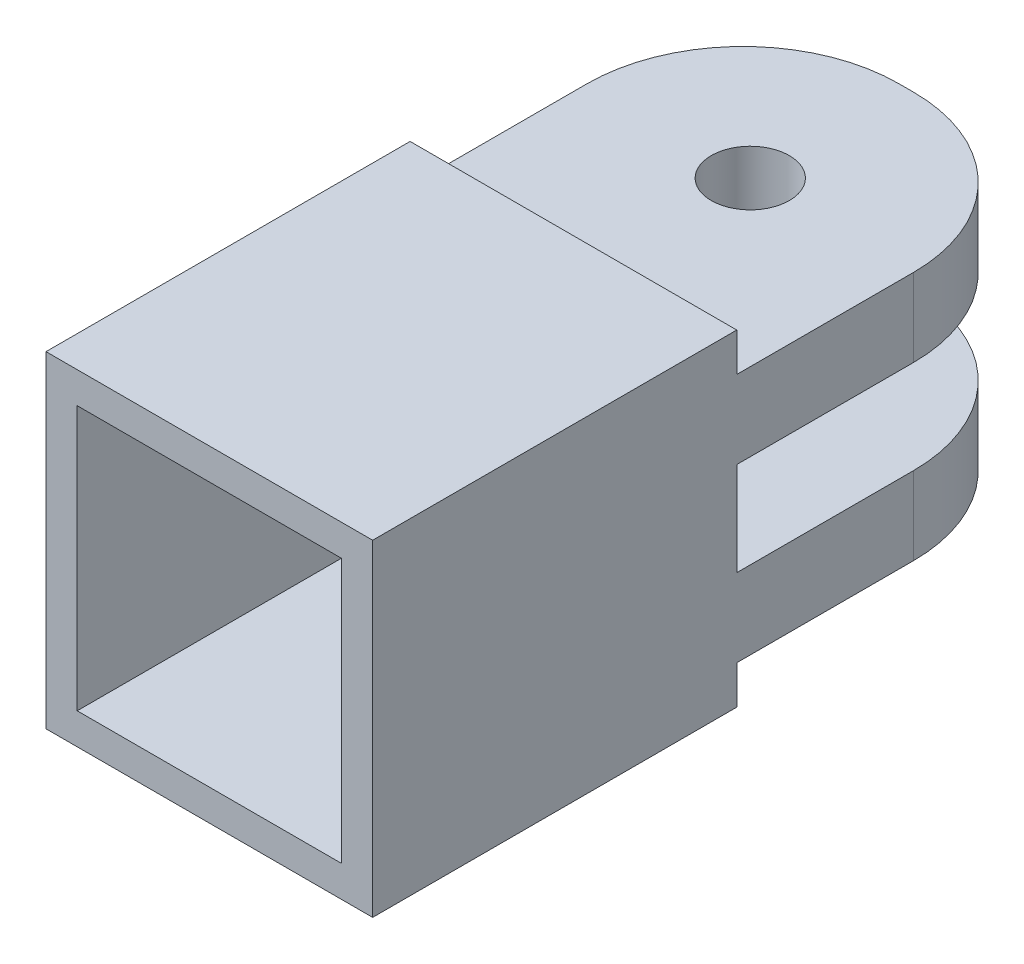
ISO-10303-21;
HEADER;
FILE_DESCRIPTION(('STEP AP214'),'2;1');
FILE_NAME('part.step','',(''),(''),'','','');
FILE_SCHEMA(('AUTOMOTIVE_DESIGN { 1 0 10303 214 1 1 1 1 }'));
ENDSEC;
DATA;
#1=APPLICATION_CONTEXT('core data for automotive mechanical design processes');
#2=APPLICATION_PROTOCOL_DEFINITION('international standard','automotive_design',2000,#1);
#3=PRODUCT_CONTEXT('',#1,'mechanical');
#4=PRODUCT('Part','Part','',(#3));
#5=PRODUCT_RELATED_PRODUCT_CATEGORY('part','',(#4));
#6=PRODUCT_DEFINITION_FORMATION('','',#4);
#7=PRODUCT_DEFINITION_CONTEXT('part definition',#1,'design');
#8=PRODUCT_DEFINITION('design','',#6,#7);
#9=PRODUCT_DEFINITION_SHAPE('','',#8);
#10=(LENGTH_UNIT() NAMED_UNIT(*) SI_UNIT(.MILLI.,.METRE.));
#11=(NAMED_UNIT(*) PLANE_ANGLE_UNIT() SI_UNIT($,.RADIAN.));
#12=(NAMED_UNIT(*) SI_UNIT($,.STERADIAN.) SOLID_ANGLE_UNIT());
#13=UNCERTAINTY_MEASURE_WITH_UNIT(LENGTH_MEASURE(1.E-05),#10,'distance_accuracy_value','');
#14=(GEOMETRIC_REPRESENTATION_CONTEXT(3) GLOBAL_UNCERTAINTY_ASSIGNED_CONTEXT((#13)) GLOBAL_UNIT_ASSIGNED_CONTEXT((#10,
#11,#12)) REPRESENTATION_CONTEXT('',''));
#15=CARTESIAN_POINT('',(0.,0.,0.));
#16=DIRECTION('',(0.,0.,1.));
#17=DIRECTION('',(1.,0.,0.));
#18=AXIS2_PLACEMENT_3D('',#15,#16,#17);
#19=CARTESIAN_POINT('',(0.,0.,-5.));
#20=DIRECTION('',(0.,0.,1.));
#21=DIRECTION('',(1.,0.,0.));
#22=AXIS2_PLACEMENT_3D('',#19,#20,#21);
#23=PLANE('',#22);
#24=DIRECTION('',(0.,1.,0.));
#25=VECTOR('',#24,1.);
#26=CARTESIAN_POINT('',(-15.7,15.7,-5.));
#27=LINE('',#26,#25);
#28=CARTESIAN_POINT('',(-15.7,-15.7,-5.));
#29=VERTEX_POINT('',#28);
#30=CARTESIAN_POINT('',(-15.7,-12.,-5.));
#31=VERTEX_POINT('',#30);
#32=EDGE_CURVE('E58',#29,#31,#27,.T.);
#33=ORIENTED_EDGE('',*,*,#32,.T.);
#34=DIRECTION('',(1.,0.,0.));
#35=VECTOR('',#34,1.);
#36=CARTESIAN_POINT('',(15.7,-12.,-5.));
#37=LINE('',#36,#35);
#38=CARTESIAN_POINT('',(15.7,-12.,-5.));
#39=VERTEX_POINT('',#38);
#40=EDGE_CURVE('E207',#31,#39,#37,.T.);
#41=ORIENTED_EDGE('',*,*,#40,.T.);
#42=DIRECTION('',(0.,-1.,0.));
#43=VECTOR('',#42,1.);
#44=CARTESIAN_POINT('',(15.7,-15.7,-5.));
#45=LINE('',#44,#43);
#46=CARTESIAN_POINT('',(15.7,-15.7,-5.));
#47=VERTEX_POINT('',#46);
#48=EDGE_CURVE('E271',#39,#47,#45,.T.);
#49=ORIENTED_EDGE('',*,*,#48,.T.);
#50=DIRECTION('',(-1.,0.,0.));
#51=VECTOR('',#50,1.);
#52=CARTESIAN_POINT('',(-15.7,-15.7,-5.));
#53=LINE('',#52,#51);
#54=EDGE_CURVE('E274',#47,#29,#53,.T.);
#55=ORIENTED_EDGE('',*,*,#54,.T.);
#56=EDGE_LOOP('',(#33,#41,#49,#55));
#57=FACE_BOUND('',#56,.T.);
#58=ADVANCED_FACE('F35',(#57),#23,.F.);
#59=DIRECTION('',(1.,0.,0.));
#60=VECTOR('',#59,1.);
#61=CARTESIAN_POINT('',(15.7,12.,-5.));
#62=LINE('',#61,#60);
#63=CARTESIAN_POINT('',(-15.7,12.,-5.));
#64=VERTEX_POINT('',#63);
#65=CARTESIAN_POINT('',(15.7,12.,-5.));
#66=VERTEX_POINT('',#65);
#67=EDGE_CURVE('E254',#64,#66,#62,.T.);
#68=ORIENTED_EDGE('',*,*,#67,.F.);
#69=CARTESIAN_POINT('',(-15.7,15.7,-5.));
#70=VERTEX_POINT('',#69);
#71=EDGE_CURVE('E277',#64,#70,#27,.T.);
#72=ORIENTED_EDGE('',*,*,#71,.T.);
#73=DIRECTION('',(1.,0.,0.));
#74=VECTOR('',#73,1.);
#75=CARTESIAN_POINT('',(15.7,15.7,-5.));
#76=LINE('',#75,#74);
#77=CARTESIAN_POINT('',(15.7,15.7,-5.));
#78=VERTEX_POINT('',#77);
#79=EDGE_CURVE('E268',#70,#78,#76,.T.);
#80=ORIENTED_EDGE('',*,*,#79,.T.);
#81=EDGE_CURVE('E272',#78,#66,#45,.T.);
#82=ORIENTED_EDGE('',*,*,#81,.T.);
#83=EDGE_LOOP('',(#68,#72,#80,#82));
#84=FACE_BOUND('',#83,.T.);
#85=ADVANCED_FACE('F373',(#84),#23,.F.);
#86=CARTESIAN_POINT('',(15.7,4.5,-5.));
#87=VERTEX_POINT('',#86);
#88=CARTESIAN_POINT('',(15.7,-4.5,-5.));
#89=VERTEX_POINT('',#88);
#90=EDGE_CURVE('E275',#87,#89,#45,.T.);
#91=ORIENTED_EDGE('',*,*,#90,.T.);
#92=DIRECTION('',(-1.,0.,0.));
#93=VECTOR('',#92,1.);
#94=CARTESIAN_POINT('',(-15.7,-4.5,-5.));
#95=LINE('',#94,#93);
#96=CARTESIAN_POINT('',(-15.7,-4.5,-5.));
#97=VERTEX_POINT('',#96);
#98=EDGE_CURVE('E50',#89,#97,#95,.T.);
#99=ORIENTED_EDGE('',*,*,#98,.T.);
#100=CARTESIAN_POINT('',(-15.7,4.5,-5.));
#101=VERTEX_POINT('',#100);
#102=EDGE_CURVE('E179',#97,#101,#27,.T.);
#103=ORIENTED_EDGE('',*,*,#102,.T.);
#104=DIRECTION('',(-1.,0.,0.));
#105=VECTOR('',#104,1.);
#106=CARTESIAN_POINT('',(-15.7,4.5,-5.));
#107=LINE('',#106,#105);
#108=EDGE_CURVE('E245',#87,#101,#107,.T.);
#109=ORIENTED_EDGE('',*,*,#108,.F.);
#110=EDGE_LOOP('',(#91,#99,#103,#109));
#111=FACE_BOUND('',#110,.T.);
#112=ADVANCED_FACE('F375',(#111),#23,.F.);
#113=CARTESIAN_POINT('',(0.,0.,30.));
#114=DIRECTION('',(0.,0.,1.));
#115=DIRECTION('',(1.,0.,0.));
#116=AXIS2_PLACEMENT_3D('',#113,#114,#115);
#117=PLANE('',#116);
#118=DIRECTION('',(0.,-1.,0.));
#119=VECTOR('',#118,1.);
#120=CARTESIAN_POINT('',(-15.7,15.7,30.));
#121=LINE('',#120,#119);
#122=CARTESIAN_POINT('',(-15.7,15.7,30.));
#123=VERTEX_POINT('',#122);
#124=CARTESIAN_POINT('',(-15.7,-15.7,30.));
#125=VERTEX_POINT('',#124);
#126=EDGE_CURVE('E309',#123,#125,#121,.T.);
#127=ORIENTED_EDGE('',*,*,#126,.T.);
#128=DIRECTION('',(1.,0.,0.));
#129=VECTOR('',#128,1.);
#130=CARTESIAN_POINT('',(-15.7,-15.7,30.));
#131=LINE('',#130,#129);
#132=CARTESIAN_POINT('',(15.7,-15.7,30.));
#133=VERTEX_POINT('',#132);
#134=EDGE_CURVE('E312',#125,#133,#131,.T.);
#135=ORIENTED_EDGE('',*,*,#134,.T.);
#136=DIRECTION('',(0.,1.,0.));
#137=VECTOR('',#136,1.);
#138=CARTESIAN_POINT('',(15.7,15.7,30.));
#139=LINE('',#138,#137);
#140=CARTESIAN_POINT('',(15.7,15.7,30.));
#141=VERTEX_POINT('',#140);
#142=EDGE_CURVE('E314',#133,#141,#139,.T.);
#143=ORIENTED_EDGE('',*,*,#142,.T.);
#144=DIRECTION('',(-1.,0.,0.));
#145=VECTOR('',#144,1.);
#146=CARTESIAN_POINT('',(-15.7,15.7,30.));
#147=LINE('',#146,#145);
#148=EDGE_CURVE('E316',#141,#123,#147,.T.);
#149=ORIENTED_EDGE('',*,*,#148,.T.);
#150=EDGE_LOOP('',(#127,#135,#143,#149));
#151=FACE_BOUND('',#150,.T.);
#152=DIRECTION('',(0.,-1.,0.));
#153=VECTOR('',#152,1.);
#154=CARTESIAN_POINT('',(-12.7,12.7,30.));
#155=LINE('',#154,#153);
#156=CARTESIAN_POINT('',(-12.7,12.7,30.));
#157=VERTEX_POINT('',#156);
#158=CARTESIAN_POINT('',(-12.7,-12.7,30.));
#159=VERTEX_POINT('',#158);
#160=EDGE_CURVE('E282',#157,#159,#155,.T.);
#161=ORIENTED_EDGE('',*,*,#160,.F.);
#162=DIRECTION('',(-1.,0.,0.));
#163=VECTOR('',#162,1.);
#164=CARTESIAN_POINT('',(-12.7,12.7,30.));
#165=LINE('',#164,#163);
#166=CARTESIAN_POINT('',(12.7,12.7,30.));
#167=VERTEX_POINT('',#166);
#168=EDGE_CURVE('E280',#167,#157,#165,.T.);
#169=ORIENTED_EDGE('',*,*,#168,.F.);
#170=DIRECTION('',(0.,1.,0.));
#171=VECTOR('',#170,1.);
#172=CARTESIAN_POINT('',(12.7,12.7,30.));
#173=LINE('',#172,#171);
#174=CARTESIAN_POINT('',(12.7,-12.7,30.));
#175=VERTEX_POINT('',#174);
#176=EDGE_CURVE('E288',#175,#167,#173,.T.);
#177=ORIENTED_EDGE('',*,*,#176,.F.);
#178=DIRECTION('',(1.,0.,0.));
#179=VECTOR('',#178,1.);
#180=CARTESIAN_POINT('',(-12.7,-12.7,30.));
#181=LINE('',#180,#179);
#182=EDGE_CURVE('E285',#159,#175,#181,.T.);
#183=ORIENTED_EDGE('',*,*,#182,.F.);
#184=EDGE_LOOP('',(#161,#169,#177,#183));
#185=FACE_BOUND('',#184,.T.);
#186=ADVANCED_FACE('F383',(#151,#185),#117,.T.);
#187=CARTESIAN_POINT('',(-15.7,15.7,30.));
#188=DIRECTION('',(1.,0.,0.));
#189=DIRECTION('',(0.,1.,0.));
#190=AXIS2_PLACEMENT_3D('',#187,#188,#189);
#191=PLANE('',#190);
#192=DIRECTION('',(0.,0.,-1.));
#193=VECTOR('',#192,1.);
#194=CARTESIAN_POINT('',(-15.7,15.7,30.));
#195=LINE('',#194,#193);
#196=EDGE_CURVE('E318',#123,#70,#195,.T.);
#197=ORIENTED_EDGE('',*,*,#196,.T.);
#198=ORIENTED_EDGE('',*,*,#71,.F.);
#199=DIRECTION('',(0.,0.,1.));
#200=VECTOR('',#199,1.);
#201=CARTESIAN_POINT('',(-15.7,12.,-10.));
#202=LINE('',#201,#200);
#203=CARTESIAN_POINT('',(-15.7,12.,-22.));
#204=VERTEX_POINT('',#203);
#205=EDGE_CURVE('E260',#204,#64,#202,.T.);
#206=ORIENTED_EDGE('',*,*,#205,.F.);
#207=DIRECTION('',(0.,1.,0.));
#208=VECTOR('',#207,1.);
#209=CARTESIAN_POINT('',(-15.7,4.5,-22.));
#210=LINE('',#209,#208);
#211=CARTESIAN_POINT('',(-15.7,4.5,-22.));
#212=VERTEX_POINT('',#211);
#213=EDGE_CURVE('E242',#212,#204,#210,.T.);
#214=ORIENTED_EDGE('',*,*,#213,.F.);
#215=DIRECTION('',(0.,0.,1.));
#216=VECTOR('',#215,1.);
#217=CARTESIAN_POINT('',(-15.7,4.5,-10.));
#218=LINE('',#217,#216);
#219=EDGE_CURVE('E263',#212,#101,#218,.T.);
#220=ORIENTED_EDGE('',*,*,#219,.T.);
#221=ORIENTED_EDGE('',*,*,#102,.F.);
#222=DIRECTION('',(0.,0.,1.));
#223=VECTOR('',#222,1.);
#224=CARTESIAN_POINT('',(-15.7,-4.5,-10.));
#225=LINE('',#224,#223);
#226=CARTESIAN_POINT('',(-15.7,-4.5,-22.));
#227=VERTEX_POINT('',#226);
#228=EDGE_CURVE('E173',#227,#97,#225,.T.);
#229=ORIENTED_EDGE('',*,*,#228,.F.);
#230=DIRECTION('',(0.,-1.,0.));
#231=VECTOR('',#230,1.);
#232=CARTESIAN_POINT('',(-15.7,-4.5,-22.));
#233=LINE('',#232,#231);
#234=CARTESIAN_POINT('',(-15.7,-12.,-22.));
#235=VERTEX_POINT('',#234);
#236=EDGE_CURVE('E177',#227,#235,#233,.T.);
#237=ORIENTED_EDGE('',*,*,#236,.T.);
#238=DIRECTION('',(0.,0.,1.));
#239=VECTOR('',#238,1.);
#240=CARTESIAN_POINT('',(-15.7,-12.,-10.));
#241=LINE('',#240,#239);
#242=EDGE_CURVE('E181',#235,#31,#241,.T.);
#243=ORIENTED_EDGE('',*,*,#242,.T.);
#244=ORIENTED_EDGE('',*,*,#32,.F.);
#245=DIRECTION('',(0.,0.,-1.));
#246=VECTOR('',#245,1.);
#247=CARTESIAN_POINT('',(-15.7,-15.7,30.));
#248=LINE('',#247,#246);
#249=EDGE_CURVE('E11',#125,#29,#248,.T.);
#250=ORIENTED_EDGE('',*,*,#249,.F.);
#251=ORIENTED_EDGE('',*,*,#126,.F.);
#252=EDGE_LOOP('',(#197,#198,#206,#214,#220,#221,#229,#237,#243,#244,#250,#251));
#253=FACE_BOUND('',#252,.T.);
#254=ADVANCED_FACE('F37',(#253),#191,.F.);
#255=CARTESIAN_POINT('',(-15.7,-15.7,30.));
#256=DIRECTION('',(0.,1.,0.));
#257=DIRECTION('',(0.,0.,1.));
#258=AXIS2_PLACEMENT_3D('',#255,#256,#257);
#259=PLANE('',#258);
#260=ORIENTED_EDGE('',*,*,#249,.T.);
#261=ORIENTED_EDGE('',*,*,#54,.F.);
#262=DIRECTION('',(0.,0.,-1.));
#263=VECTOR('',#262,1.);
#264=CARTESIAN_POINT('',(15.7,-15.7,30.));
#265=LINE('',#264,#263);
#266=EDGE_CURVE('E43',#133,#47,#265,.T.);
#267=ORIENTED_EDGE('',*,*,#266,.F.);
#268=ORIENTED_EDGE('',*,*,#134,.F.);
#269=EDGE_LOOP('',(#260,#261,#267,#268));
#270=FACE_BOUND('',#269,.T.);
#271=ADVANCED_FACE('F329',(#270),#259,.F.);
#272=CARTESIAN_POINT('',(15.7,15.7,30.));
#273=DIRECTION('',(-1.,0.,0.));
#274=DIRECTION('',(0.,0.,1.));
#275=AXIS2_PLACEMENT_3D('',#272,#273,#274);
#276=PLANE('',#275);
#277=ORIENTED_EDGE('',*,*,#266,.T.);
#278=ORIENTED_EDGE('',*,*,#48,.F.);
#279=DIRECTION('',(0.,0.,1.));
#280=VECTOR('',#279,1.);
#281=CARTESIAN_POINT('',(15.7,-12.,-10.));
#282=LINE('',#281,#280);
#283=CARTESIAN_POINT('',(15.7,-12.,-22.));
#284=VERTEX_POINT('',#283);
#285=EDGE_CURVE('E214',#284,#39,#282,.T.);
#286=ORIENTED_EDGE('',*,*,#285,.F.);
#287=DIRECTION('',(0.,-1.,0.));
#288=VECTOR('',#287,1.);
#289=CARTESIAN_POINT('',(15.7,-4.5,-22.));
#290=LINE('',#289,#288);
#291=CARTESIAN_POINT('',(15.7,-4.5,-22.));
#292=VERTEX_POINT('',#291);
#293=EDGE_CURVE('E209',#292,#284,#290,.T.);
#294=ORIENTED_EDGE('',*,*,#293,.F.);
#295=DIRECTION('',(0.,0.,1.));
#296=VECTOR('',#295,1.);
#297=CARTESIAN_POINT('',(15.7,-4.5,-10.));
#298=LINE('',#297,#296);
#299=EDGE_CURVE('E182',#292,#89,#298,.T.);
#300=ORIENTED_EDGE('',*,*,#299,.T.);
#301=ORIENTED_EDGE('',*,*,#90,.F.);
#302=DIRECTION('',(0.,0.,1.));
#303=VECTOR('',#302,1.);
#304=CARTESIAN_POINT('',(15.7,4.5,-10.));
#305=LINE('',#304,#303);
#306=CARTESIAN_POINT('',(15.7,4.5,-22.));
#307=VERTEX_POINT('',#306);
#308=EDGE_CURVE('E265',#307,#87,#305,.T.);
#309=ORIENTED_EDGE('',*,*,#308,.F.);
#310=DIRECTION('',(0.,1.,0.));
#311=VECTOR('',#310,1.);
#312=CARTESIAN_POINT('',(15.7,4.5,-22.));
#313=LINE('',#312,#311);
#314=CARTESIAN_POINT('',(15.7,12.,-22.));
#315=VERTEX_POINT('',#314);
#316=EDGE_CURVE('E234',#307,#315,#313,.T.);
#317=ORIENTED_EDGE('',*,*,#316,.T.);
#318=DIRECTION('',(0.,0.,1.));
#319=VECTOR('',#318,1.);
#320=CARTESIAN_POINT('',(15.7,12.,-10.));
#321=LINE('',#320,#319);
#322=EDGE_CURVE('E257',#315,#66,#321,.T.);
#323=ORIENTED_EDGE('',*,*,#322,.T.);
#324=ORIENTED_EDGE('',*,*,#81,.F.);
#325=DIRECTION('',(0.,0.,-1.));
#326=VECTOR('',#325,1.);
#327=CARTESIAN_POINT('',(15.7,15.7,30.));
#328=LINE('',#327,#326);
#329=EDGE_CURVE('E320',#141,#78,#328,.T.);
#330=ORIENTED_EDGE('',*,*,#329,.F.);
#331=ORIENTED_EDGE('',*,*,#142,.F.);
#332=EDGE_LOOP('',(#277,#278,#286,#294,#300,#301,#309,#317,#323,#324,#330,#331));
#333=FACE_BOUND('',#332,.T.);
#334=ADVANCED_FACE('F326',(#333),#276,.F.);
#335=CARTESIAN_POINT('',(-15.7,15.7,30.));
#336=DIRECTION('',(0.,-1.,0.));
#337=DIRECTION('',(0.,0.,-1.));
#338=AXIS2_PLACEMENT_3D('',#335,#336,#337);
#339=PLANE('',#338);
#340=ORIENTED_EDGE('',*,*,#329,.T.);
#341=ORIENTED_EDGE('',*,*,#79,.F.);
#342=ORIENTED_EDGE('',*,*,#196,.F.);
#343=ORIENTED_EDGE('',*,*,#148,.F.);
#344=EDGE_LOOP('',(#340,#341,#342,#343));
#345=FACE_BOUND('',#344,.T.);
#346=ADVANCED_FACE('F436',(#345),#339,.F.);
#347=CARTESIAN_POINT('',(-12.7,12.7,30.));
#348=DIRECTION('',(0.,-1.,0.));
#349=DIRECTION('',(0.,0.,-1.));
#350=AXIS2_PLACEMENT_3D('',#347,#348,#349);
#351=PLANE('',#350);
#352=DIRECTION('',(-1.,0.,0.));
#353=VECTOR('',#352,1.);
#354=CARTESIAN_POINT('',(-12.7,12.7,0.));
#355=LINE('',#354,#353);
#356=CARTESIAN_POINT('',(12.7,12.7,0.));
#357=VERTEX_POINT('',#356);
#358=CARTESIAN_POINT('',(-12.7,12.7,0.));
#359=VERTEX_POINT('',#358);
#360=EDGE_CURVE('E279',#357,#359,#355,.T.);
#361=ORIENTED_EDGE('',*,*,#360,.F.);
#362=DIRECTION('',(0.,0.,-1.));
#363=VECTOR('',#362,1.);
#364=CARTESIAN_POINT('',(12.7,12.7,30.));
#365=LINE('',#364,#363);
#366=EDGE_CURVE('E290',#167,#357,#365,.T.);
#367=ORIENTED_EDGE('',*,*,#366,.F.);
#368=ORIENTED_EDGE('',*,*,#168,.T.);
#369=DIRECTION('',(0.,0.,-1.));
#370=VECTOR('',#369,1.);
#371=CARTESIAN_POINT('',(-12.7,12.7,30.));
#372=LINE('',#371,#370);
#373=EDGE_CURVE('E306',#157,#359,#372,.T.);
#374=ORIENTED_EDGE('',*,*,#373,.T.);
#375=EDGE_LOOP('',(#361,#367,#368,#374));
#376=FACE_BOUND('',#375,.T.);
#377=ADVANCED_FACE('F563',(#376),#351,.T.);
#378=CARTESIAN_POINT('',(-12.7,12.7,30.));
#379=DIRECTION('',(1.,0.,0.));
#380=DIRECTION('',(0.,1.,0.));
#381=AXIS2_PLACEMENT_3D('',#378,#379,#380);
#382=PLANE('',#381);
#383=DIRECTION('',(0.,-1.,0.));
#384=VECTOR('',#383,1.);
#385=CARTESIAN_POINT('',(-12.7,12.7,0.));
#386=LINE('',#385,#384);
#387=CARTESIAN_POINT('',(-12.7,-12.7,0.));
#388=VERTEX_POINT('',#387);
#389=EDGE_CURVE('E293',#359,#388,#386,.T.);
#390=ORIENTED_EDGE('',*,*,#389,.F.);
#391=ORIENTED_EDGE('',*,*,#373,.F.);
#392=ORIENTED_EDGE('',*,*,#160,.T.);
#393=DIRECTION('',(0.,0.,-1.));
#394=VECTOR('',#393,1.);
#395=CARTESIAN_POINT('',(-12.7,-12.7,30.));
#396=LINE('',#395,#394);
#397=EDGE_CURVE('E304',#159,#388,#396,.T.);
#398=ORIENTED_EDGE('',*,*,#397,.T.);
#399=EDGE_LOOP('',(#390,#391,#392,#398));
#400=FACE_BOUND('',#399,.T.);
#401=ADVANCED_FACE('F553',(#400),#382,.T.);
#402=CARTESIAN_POINT('',(-12.7,-12.7,30.));
#403=DIRECTION('',(0.,1.,0.));
#404=DIRECTION('',(-1.,0.,0.));
#405=AXIS2_PLACEMENT_3D('',#402,#403,#404);
#406=PLANE('',#405);
#407=DIRECTION('',(1.,0.,0.));
#408=VECTOR('',#407,1.);
#409=CARTESIAN_POINT('',(-12.7,-12.7,0.));
#410=LINE('',#409,#408);
#411=CARTESIAN_POINT('',(12.7,-12.7,0.));
#412=VERTEX_POINT('',#411);
#413=EDGE_CURVE('E296',#388,#412,#410,.T.);
#414=ORIENTED_EDGE('',*,*,#413,.F.);
#415=ORIENTED_EDGE('',*,*,#397,.F.);
#416=ORIENTED_EDGE('',*,*,#182,.T.);
#417=DIRECTION('',(0.,0.,-1.));
#418=VECTOR('',#417,1.);
#419=CARTESIAN_POINT('',(12.7,-12.7,30.));
#420=LINE('',#419,#418);
#421=EDGE_CURVE('E302',#175,#412,#420,.T.);
#422=ORIENTED_EDGE('',*,*,#421,.T.);
#423=EDGE_LOOP('',(#414,#415,#416,#422));
#424=FACE_BOUND('',#423,.T.);
#425=ADVANCED_FACE('F542',(#424),#406,.T.);
#426=CARTESIAN_POINT('',(12.7,12.7,30.));
#427=DIRECTION('',(-1.,0.,0.));
#428=DIRECTION('',(0.,-1.,0.));
#429=AXIS2_PLACEMENT_3D('',#426,#427,#428);
#430=PLANE('',#429);
#431=DIRECTION('',(0.,1.,0.));
#432=VECTOR('',#431,1.);
#433=CARTESIAN_POINT('',(12.7,12.7,0.));
#434=LINE('',#433,#432);
#435=EDGE_CURVE('E283',#412,#357,#434,.T.);
#436=ORIENTED_EDGE('',*,*,#435,.F.);
#437=ORIENTED_EDGE('',*,*,#421,.F.);
#438=ORIENTED_EDGE('',*,*,#176,.T.);
#439=ORIENTED_EDGE('',*,*,#366,.T.);
#440=EDGE_LOOP('',(#436,#437,#438,#439));
#441=FACE_BOUND('',#440,.T.);
#442=ADVANCED_FACE('F532',(#441),#430,.T.);
#443=CARTESIAN_POINT('',(0.,0.,0.));
#444=DIRECTION('',(0.,0.,1.));
#445=DIRECTION('',(1.,0.,0.));
#446=AXIS2_PLACEMENT_3D('',#443,#444,#445);
#447=PLANE('',#446);
#448=ORIENTED_EDGE('',*,*,#435,.T.);
#449=ORIENTED_EDGE('',*,*,#360,.T.);
#450=ORIENTED_EDGE('',*,*,#389,.T.);
#451=ORIENTED_EDGE('',*,*,#413,.T.);
#452=EDGE_LOOP('',(#448,#449,#450,#451));
#453=FACE_BOUND('',#452,.T.);
#454=ADVANCED_FACE('F516',(#453),#447,.T.);
#455=CARTESIAN_POINT('',(-15.7,4.5,-10.));
#456=DIRECTION('',(0.,1.,0.));
#457=DIRECTION('',(-1.,0.,0.));
#458=AXIS2_PLACEMENT_3D('',#455,#456,#457);
#459=PLANE('',#458);
#460=ORIENTED_EDGE('',*,*,#108,.T.);
#461=ORIENTED_EDGE('',*,*,#219,.F.);
#462=CARTESIAN_POINT('',(-0.699999999999992,4.5,-22.));
#463=DIRECTION('',(0.,1.,0.));
#464=DIRECTION('',(0.,0.,-1.));
#465=AXIS2_PLACEMENT_3D('',#462,#463,#464);
#466=CIRCLE('',#465,15.);
#467=CARTESIAN_POINT('',(-0.699999999999992,4.5,-37.));
#468=VERTEX_POINT('',#467);
#469=EDGE_CURVE('E231',#468,#212,#466,.T.);
#470=ORIENTED_EDGE('',*,*,#469,.F.);
#471=DIRECTION('',(-1.,0.,0.));
#472=VECTOR('',#471,1.);
#473=CARTESIAN_POINT('',(0.699999999999994,4.5,-37.));
#474=LINE('',#473,#472);
#475=CARTESIAN_POINT('',(0.699999999999994,4.5,-37.));
#476=VERTEX_POINT('',#475);
#477=EDGE_CURVE('E227',#476,#468,#474,.T.);
#478=ORIENTED_EDGE('',*,*,#477,.F.);
#479=CARTESIAN_POINT('',(0.699999999999996,4.5,-22.));
#480=DIRECTION('',(0.,1.,0.));
#481=DIRECTION('',(0.,0.,-1.));
#482=AXIS2_PLACEMENT_3D('',#479,#480,#481);
#483=CIRCLE('',#482,15.);
#484=EDGE_CURVE('E224',#307,#476,#483,.T.);
#485=ORIENTED_EDGE('',*,*,#484,.F.);
#486=ORIENTED_EDGE('',*,*,#308,.T.);
#487=EDGE_LOOP('',(#460,#461,#470,#478,#485,#486));
#488=FACE_BOUND('',#487,.T.);
#489=CARTESIAN_POINT('',(0.,4.5,-22.));
#490=DIRECTION('',(0.,1.,0.));
#491=DIRECTION('',(0.,0.,1.));
#492=AXIS2_PLACEMENT_3D('',#489,#490,#491);
#493=CIRCLE('',#492,3.75);
#494=CARTESIAN_POINT('',(0.,4.5,-18.25));
#495=VERTEX_POINT('',#494);
#496=EDGE_CURVE('E218',#495,#495,#493,.T.);
#497=ORIENTED_EDGE('',*,*,#496,.T.);
#498=EDGE_LOOP('',(#497));
#499=FACE_BOUND('',#498,.T.);
#500=ADVANCED_FACE('F505',(#488,#499),#459,.F.);
#501=CARTESIAN_POINT('',(15.7,12.,-10.));
#502=DIRECTION('',(0.,-1.,0.));
#503=DIRECTION('',(0.,0.,-1.));
#504=AXIS2_PLACEMENT_3D('',#501,#502,#503);
#505=PLANE('',#504);
#506=ORIENTED_EDGE('',*,*,#67,.T.);
#507=ORIENTED_EDGE('',*,*,#322,.F.);
#508=CARTESIAN_POINT('',(0.699999999999996,12.,-22.));
#509=DIRECTION('',(0.,1.,0.));
#510=DIRECTION('',(0.,0.,-1.));
#511=AXIS2_PLACEMENT_3D('',#508,#509,#510);
#512=CIRCLE('',#511,15.);
#513=CARTESIAN_POINT('',(0.699999999999994,12.,-37.));
#514=VERTEX_POINT('',#513);
#515=EDGE_CURVE('E221',#315,#514,#512,.T.);
#516=ORIENTED_EDGE('',*,*,#515,.T.);
#517=DIRECTION('',(-1.,0.,0.));
#518=VECTOR('',#517,1.);
#519=CARTESIAN_POINT('',(0.699999999999994,12.,-37.));
#520=LINE('',#519,#518);
#521=CARTESIAN_POINT('',(-0.699999999999992,12.,-37.));
#522=VERTEX_POINT('',#521);
#523=EDGE_CURVE('E237',#514,#522,#520,.T.);
#524=ORIENTED_EDGE('',*,*,#523,.T.);
#525=CARTESIAN_POINT('',(-0.699999999999992,12.,-22.));
#526=DIRECTION('',(0.,1.,0.));
#527=DIRECTION('',(0.,0.,-1.));
#528=AXIS2_PLACEMENT_3D('',#525,#526,#527);
#529=CIRCLE('',#528,15.);
#530=EDGE_CURVE('E228',#522,#204,#529,.T.);
#531=ORIENTED_EDGE('',*,*,#530,.T.);
#532=ORIENTED_EDGE('',*,*,#205,.T.);
#533=EDGE_LOOP('',(#506,#507,#516,#524,#531,#532));
#534=FACE_BOUND('',#533,.T.);
#535=CARTESIAN_POINT('',(0.,12.,-22.));
#536=DIRECTION('',(0.,1.,0.));
#537=DIRECTION('',(0.,0.,1.));
#538=AXIS2_PLACEMENT_3D('',#535,#536,#537);
#539=CIRCLE('',#538,3.75);
#540=CARTESIAN_POINT('',(0.,12.,-18.25));
#541=VERTEX_POINT('',#540);
#542=EDGE_CURVE('E217',#541,#541,#539,.T.);
#543=ORIENTED_EDGE('',*,*,#542,.F.);
#544=EDGE_LOOP('',(#543));
#545=FACE_BOUND('',#544,.T.);
#546=ADVANCED_FACE('F495',(#534,#545),#505,.F.);
#547=CARTESIAN_POINT('',(-0.699999999999992,4.5,-22.));
#548=DIRECTION('',(0.,1.,0.));
#549=DIRECTION('',(0.,0.,1.));
#550=AXIS2_PLACEMENT_3D('',#547,#548,#549);
#551=CYLINDRICAL_SURFACE('',#550,15.);
#552=ORIENTED_EDGE('',*,*,#530,.F.);
#553=DIRECTION('',(0.,1.,0.));
#554=VECTOR('',#553,1.);
#555=CARTESIAN_POINT('',(-0.699999999999992,4.5,-37.));
#556=LINE('',#555,#554);
#557=EDGE_CURVE('E246',#468,#522,#556,.T.);
#558=ORIENTED_EDGE('',*,*,#557,.F.);
#559=ORIENTED_EDGE('',*,*,#469,.T.);
#560=ORIENTED_EDGE('',*,*,#213,.T.);
#561=EDGE_LOOP('',(#552,#558,#559,#560));
#562=FACE_BOUND('',#561,.T.);
#563=ADVANCED_FACE('F485',(#562),#551,.T.);
#564=CARTESIAN_POINT('',(0.699999999999994,4.5,-37.));
#565=DIRECTION('',(0.,0.,-1.));
#566=DIRECTION('',(-1.,0.,0.));
#567=AXIS2_PLACEMENT_3D('',#564,#565,#566);
#568=PLANE('',#567);
#569=ORIENTED_EDGE('',*,*,#523,.F.);
#570=DIRECTION('',(0.,1.,0.));
#571=VECTOR('',#570,1.);
#572=CARTESIAN_POINT('',(0.699999999999994,4.5,-37.));
#573=LINE('',#572,#571);
#574=EDGE_CURVE('E248',#476,#514,#573,.T.);
#575=ORIENTED_EDGE('',*,*,#574,.F.);
#576=ORIENTED_EDGE('',*,*,#477,.T.);
#577=ORIENTED_EDGE('',*,*,#557,.T.);
#578=EDGE_LOOP('',(#569,#575,#576,#577));
#579=FACE_BOUND('',#578,.T.);
#580=ADVANCED_FACE('F475',(#579),#568,.T.);
#581=CARTESIAN_POINT('',(0.699999999999996,4.5,-22.));
#582=DIRECTION('',(0.,1.,0.));
#583=DIRECTION('',(0.,0.,1.));
#584=AXIS2_PLACEMENT_3D('',#581,#582,#583);
#585=CYLINDRICAL_SURFACE('',#584,15.);
#586=ORIENTED_EDGE('',*,*,#515,.F.);
#587=ORIENTED_EDGE('',*,*,#316,.F.);
#588=ORIENTED_EDGE('',*,*,#484,.T.);
#589=ORIENTED_EDGE('',*,*,#574,.T.);
#590=EDGE_LOOP('',(#586,#587,#588,#589));
#591=FACE_BOUND('',#590,.T.);
#592=ADVANCED_FACE('F465',(#591),#585,.T.);
#593=CARTESIAN_POINT('',(0.,4.5,-22.));
#594=DIRECTION('',(0.,1.,0.));
#595=DIRECTION('',(0.,0.,1.));
#596=AXIS2_PLACEMENT_3D('',#593,#594,#595);
#597=CYLINDRICAL_SURFACE('',#596,3.75);
#598=ORIENTED_EDGE('',*,*,#496,.F.);
#599=EDGE_LOOP('',(#598));
#600=FACE_BOUND('',#599,.T.);
#601=ORIENTED_EDGE('',*,*,#542,.T.);
#602=EDGE_LOOP('',(#601));
#603=FACE_BOUND('',#602,.T.);
#604=ADVANCED_FACE('F369',(#600,#603),#597,.F.);
#605=CARTESIAN_POINT('',(15.7,-12.,-10.));
#606=DIRECTION('',(0.,-1.,0.));
#607=DIRECTION('',(0.,0.,-1.));
#608=AXIS2_PLACEMENT_3D('',#605,#606,#607);
#609=PLANE('',#608);
#610=ORIENTED_EDGE('',*,*,#40,.F.);
#611=ORIENTED_EDGE('',*,*,#242,.F.);
#612=CARTESIAN_POINT('',(-0.699999999999992,-12.,-22.));
#613=DIRECTION('',(0.,1.,0.));
#614=DIRECTION('',(0.,0.,-1.));
#615=AXIS2_PLACEMENT_3D('',#612,#613,#614);
#616=CIRCLE('',#615,15.);
#617=CARTESIAN_POINT('',(-0.699999999999992,-12.,-37.));
#618=VERTEX_POINT('',#617);
#619=EDGE_CURVE('E198',#618,#235,#616,.T.);
#620=ORIENTED_EDGE('',*,*,#619,.F.);
#621=DIRECTION('',(-1.,0.,0.));
#622=VECTOR('',#621,1.);
#623=CARTESIAN_POINT('',(0.699999999999994,-12.,-37.));
#624=LINE('',#623,#622);
#625=CARTESIAN_POINT('',(0.699999999999994,-12.,-37.));
#626=VERTEX_POINT('',#625);
#627=EDGE_CURVE('E348',#626,#618,#624,.T.);
#628=ORIENTED_EDGE('',*,*,#627,.F.);
#629=CARTESIAN_POINT('',(0.699999999999996,-12.,-22.));
#630=DIRECTION('',(0.,1.,0.));
#631=DIRECTION('',(0.,0.,-1.));
#632=AXIS2_PLACEMENT_3D('',#629,#630,#631);
#633=CIRCLE('',#632,15.);
#634=EDGE_CURVE('E193',#284,#626,#633,.T.);
#635=ORIENTED_EDGE('',*,*,#634,.F.);
#636=ORIENTED_EDGE('',*,*,#285,.T.);
#637=EDGE_LOOP('',(#610,#611,#620,#628,#635,#636));
#638=FACE_BOUND('',#637,.T.);
#639=CARTESIAN_POINT('',(0.,-12.,-22.));
#640=DIRECTION('',(0.,1.,0.));
#641=DIRECTION('',(0.,0.,1.));
#642=AXIS2_PLACEMENT_3D('',#639,#640,#641);
#643=CIRCLE('',#642,3.75);
#644=CARTESIAN_POINT('',(0.,-12.,-18.25));
#645=VERTEX_POINT('',#644);
#646=EDGE_CURVE('E353',#645,#645,#643,.T.);
#647=ORIENTED_EDGE('',*,*,#646,.T.);
#648=EDGE_LOOP('',(#647));
#649=FACE_BOUND('',#648,.T.);
#650=ADVANCED_FACE('F334',(#638,#649),#609,.T.);
#651=CARTESIAN_POINT('',(-15.7,-4.5,-10.));
#652=DIRECTION('',(0.,1.,0.));
#653=DIRECTION('',(-1.,0.,0.));
#654=AXIS2_PLACEMENT_3D('',#651,#652,#653);
#655=PLANE('',#654);
#656=ORIENTED_EDGE('',*,*,#98,.F.);
#657=ORIENTED_EDGE('',*,*,#299,.F.);
#658=CARTESIAN_POINT('',(0.699999999999996,-4.5,-22.));
#659=DIRECTION('',(0.,1.,0.));
#660=DIRECTION('',(0.,0.,-1.));
#661=AXIS2_PLACEMENT_3D('',#658,#659,#660);
#662=CIRCLE('',#661,15.);
#663=CARTESIAN_POINT('',(0.699999999999994,-4.5,-37.));
#664=VERTEX_POINT('',#663);
#665=EDGE_CURVE('E200',#292,#664,#662,.T.);
#666=ORIENTED_EDGE('',*,*,#665,.T.);
#667=DIRECTION('',(-1.,0.,0.));
#668=VECTOR('',#667,1.);
#669=CARTESIAN_POINT('',(0.699999999999994,-4.5,-37.));
#670=LINE('',#669,#668);
#671=CARTESIAN_POINT('',(-0.699999999999992,-4.5,-37.));
#672=VERTEX_POINT('',#671);
#673=EDGE_CURVE('E189',#664,#672,#670,.T.);
#674=ORIENTED_EDGE('',*,*,#673,.T.);
#675=CARTESIAN_POINT('',(-0.699999999999992,-4.5,-22.));
#676=DIRECTION('',(0.,1.,0.));
#677=DIRECTION('',(0.,0.,-1.));
#678=AXIS2_PLACEMENT_3D('',#675,#676,#677);
#679=CIRCLE('',#678,15.);
#680=EDGE_CURVE('E185',#672,#227,#679,.T.);
#681=ORIENTED_EDGE('',*,*,#680,.T.);
#682=ORIENTED_EDGE('',*,*,#228,.T.);
#683=EDGE_LOOP('',(#656,#657,#666,#674,#681,#682));
#684=FACE_BOUND('',#683,.T.);
#685=CARTESIAN_POINT('',(0.,-4.5,-22.));
#686=DIRECTION('',(0.,1.,0.));
#687=DIRECTION('',(0.,0.,1.));
#688=AXIS2_PLACEMENT_3D('',#685,#686,#687);
#689=CIRCLE('',#688,3.75);
#690=CARTESIAN_POINT('',(0.,-4.5,-18.25));
#691=VERTEX_POINT('',#690);
#692=EDGE_CURVE('E350',#691,#691,#689,.T.);
#693=ORIENTED_EDGE('',*,*,#692,.F.);
#694=EDGE_LOOP('',(#693));
#695=FACE_BOUND('',#694,.T.);
#696=ADVANCED_FACE('F186',(#684,#695),#655,.T.);
#697=CARTESIAN_POINT('',(0.699999999999996,-4.5,-22.));
#698=DIRECTION('',(0.,-1.,0.));
#699=DIRECTION('',(0.,0.,-1.));
#700=AXIS2_PLACEMENT_3D('',#697,#698,#699);
#701=CYLINDRICAL_SURFACE('',#700,15.);
#702=ORIENTED_EDGE('',*,*,#634,.T.);
#703=DIRECTION('',(0.,-1.,0.));
#704=VECTOR('',#703,1.);
#705=CARTESIAN_POINT('',(0.699999999999994,-4.5,-37.));
#706=LINE('',#705,#704);
#707=EDGE_CURVE('E202',#664,#626,#706,.T.);
#708=ORIENTED_EDGE('',*,*,#707,.F.);
#709=ORIENTED_EDGE('',*,*,#665,.F.);
#710=ORIENTED_EDGE('',*,*,#293,.T.);
#711=EDGE_LOOP('',(#702,#708,#709,#710));
#712=FACE_BOUND('',#711,.T.);
#713=ADVANCED_FACE('F342',(#712),#701,.T.);
#714=CARTESIAN_POINT('',(0.699999999999994,-4.5,-37.));
#715=DIRECTION('',(0.,0.,1.));
#716=DIRECTION('',(1.,0.,0.));
#717=AXIS2_PLACEMENT_3D('',#714,#715,#716);
#718=PLANE('',#717);
#719=ORIENTED_EDGE('',*,*,#627,.T.);
#720=DIRECTION('',(0.,-1.,0.));
#721=VECTOR('',#720,1.);
#722=CARTESIAN_POINT('',(-0.699999999999992,-4.5,-37.));
#723=LINE('',#722,#721);
#724=EDGE_CURVE('E199',#672,#618,#723,.T.);
#725=ORIENTED_EDGE('',*,*,#724,.F.);
#726=ORIENTED_EDGE('',*,*,#673,.F.);
#727=ORIENTED_EDGE('',*,*,#707,.T.);
#728=EDGE_LOOP('',(#719,#725,#726,#727));
#729=FACE_BOUND('',#728,.T.);
#730=ADVANCED_FACE('F367',(#729),#718,.F.);
#731=CARTESIAN_POINT('',(-0.699999999999992,-4.5,-22.));
#732=DIRECTION('',(0.,-1.,0.));
#733=DIRECTION('',(0.,0.,-1.));
#734=AXIS2_PLACEMENT_3D('',#731,#732,#733);
#735=CYLINDRICAL_SURFACE('',#734,15.);
#736=ORIENTED_EDGE('',*,*,#619,.T.);
#737=ORIENTED_EDGE('',*,*,#236,.F.);
#738=ORIENTED_EDGE('',*,*,#680,.F.);
#739=ORIENTED_EDGE('',*,*,#724,.T.);
#740=EDGE_LOOP('',(#736,#737,#738,#739));
#741=FACE_BOUND('',#740,.T.);
#742=ADVANCED_FACE('F196',(#741),#735,.T.);
#743=CARTESIAN_POINT('',(0.,-4.5,-22.));
#744=DIRECTION('',(0.,-1.,0.));
#745=DIRECTION('',(0.,0.,-1.));
#746=AXIS2_PLACEMENT_3D('',#743,#744,#745);
#747=CYLINDRICAL_SURFACE('',#746,3.75);
#748=ORIENTED_EDGE('',*,*,#692,.T.);
#749=EDGE_LOOP('',(#748));
#750=FACE_BOUND('',#749,.T.);
#751=ORIENTED_EDGE('',*,*,#646,.F.);
#752=EDGE_LOOP('',(#751));
#753=FACE_BOUND('',#752,.T.);
#754=ADVANCED_FACE('F359',(#750,#753),#747,.F.);
#755=CLOSED_SHELL('',(#58,#85,#112,#186,#254,#271,#334,#346,#377,#401,#425,#442,#454,#500,#546,
#563,#580,#592,#604,#650,#696,#713,#730,#742,#754));
#756=MANIFOLD_SOLID_BREP('B2',#755);
#757=ADVANCED_BREP_SHAPE_REPRESENTATION('',(#18,#756),#14);
#758=SHAPE_DEFINITION_REPRESENTATION(#9,#757);
ENDSEC;
END-ISO-10303-21;
